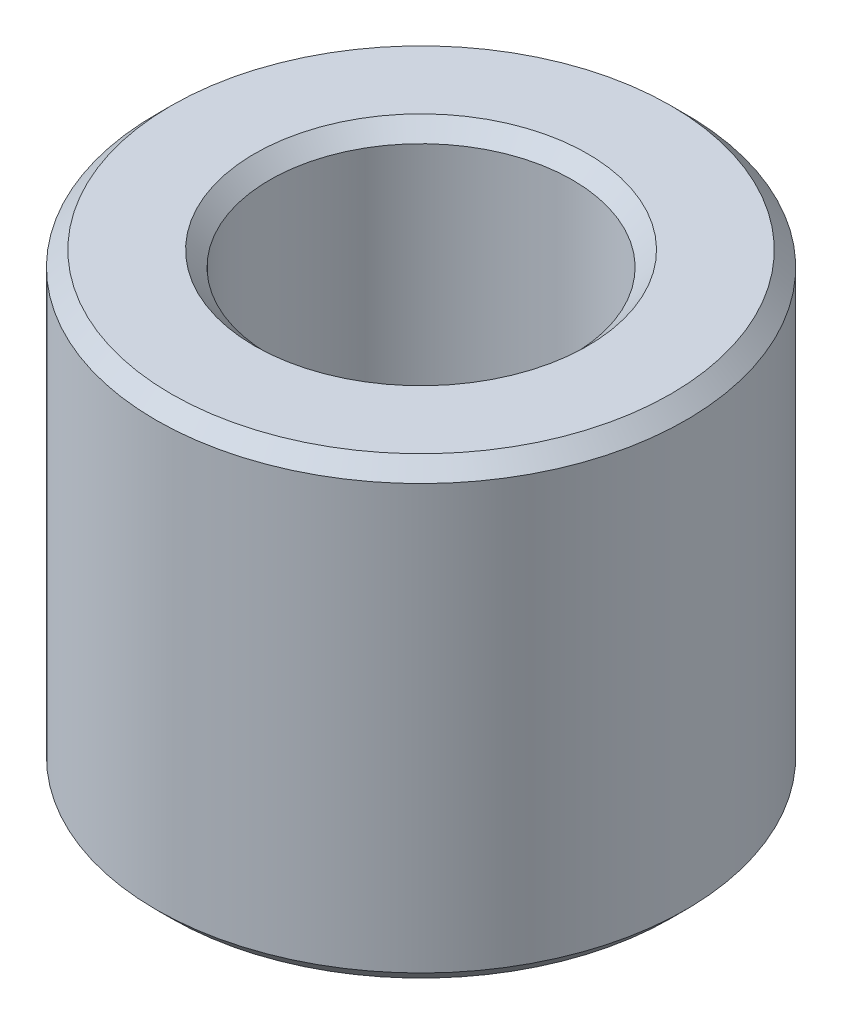
ISO-10303-21;
HEADER;
FILE_DESCRIPTION(('STEP AP214'),'2;1');
FILE_NAME('part.step','',(''),(''),'','','');
FILE_SCHEMA(('AUTOMOTIVE_DESIGN { 1 0 10303 214 1 1 1 1 }'));
ENDSEC;
DATA;
#1=APPLICATION_CONTEXT('core data for automotive mechanical design processes');
#2=APPLICATION_PROTOCOL_DEFINITION('international standard','automotive_design',2000,#1);
#3=PRODUCT_CONTEXT('',#1,'mechanical');
#4=PRODUCT('Part','Part','',(#3));
#5=PRODUCT_RELATED_PRODUCT_CATEGORY('part','',(#4));
#6=PRODUCT_DEFINITION_FORMATION('','',#4);
#7=PRODUCT_DEFINITION_CONTEXT('part definition',#1,'design');
#8=PRODUCT_DEFINITION('design','',#6,#7);
#9=PRODUCT_DEFINITION_SHAPE('','',#8);
#10=(LENGTH_UNIT() NAMED_UNIT(*) SI_UNIT(.MILLI.,.METRE.));
#11=(NAMED_UNIT(*) PLANE_ANGLE_UNIT() SI_UNIT($,.RADIAN.));
#12=(NAMED_UNIT(*) SI_UNIT($,.STERADIAN.) SOLID_ANGLE_UNIT());
#13=UNCERTAINTY_MEASURE_WITH_UNIT(LENGTH_MEASURE(1.E-05),#10,'distance_accuracy_value','');
#14=(GEOMETRIC_REPRESENTATION_CONTEXT(3) GLOBAL_UNCERTAINTY_ASSIGNED_CONTEXT((#13)) GLOBAL_UNIT_ASSIGNED_CONTEXT((#10,
#11,#12)) REPRESENTATION_CONTEXT('',''));
#15=CARTESIAN_POINT('',(0.,0.,0.));
#16=DIRECTION('',(0.,0.,1.));
#17=DIRECTION('',(1.,0.,0.));
#18=AXIS2_PLACEMENT_3D('',#15,#16,#17);
#19=CARTESIAN_POINT('',(0.,6.,0.));
#20=DIRECTION('',(0.,1.,0.));
#21=DIRECTION('',(0.,0.,1.));
#22=AXIS2_PLACEMENT_3D('',#19,#20,#21);
#23=PLANE('',#22);
#24=CARTESIAN_POINT('',(0.,6.,0.));
#25=DIRECTION('',(0.,1.,0.));
#26=DIRECTION('',(0.,0.,1.));
#27=AXIS2_PLACEMENT_3D('',#24,#25,#26);
#28=CIRCLE('',#27,2.2);
#29=CARTESIAN_POINT('',(0.,6.,2.2));
#30=VERTEX_POINT('',#29);
#31=EDGE_CURVE('E10',#30,#30,#28,.F.);
#32=ORIENTED_EDGE('',*,*,#31,.T.);
#33=EDGE_LOOP('',(#32));
#34=FACE_BOUND('',#33,.T.);
#35=CARTESIAN_POINT('',(0.,6.,0.));
#36=DIRECTION('',(0.,1.,0.));
#37=DIRECTION('',(0.,0.,1.));
#38=AXIS2_PLACEMENT_3D('',#35,#36,#37);
#39=CIRCLE('',#38,3.3);
#40=CARTESIAN_POINT('',(0.,6.,3.3));
#41=VERTEX_POINT('',#40);
#42=EDGE_CURVE('E52',#41,#41,#39,.T.);
#43=ORIENTED_EDGE('',*,*,#42,.T.);
#44=EDGE_LOOP('',(#43));
#45=FACE_BOUND('',#44,.T.);
#46=ADVANCED_FACE('F43',(#34,#45),#23,.T.);
#47=CARTESIAN_POINT('',(0.,0.,0.));
#48=DIRECTION('',(0.,1.,0.));
#49=DIRECTION('',(0.,0.,1.));
#50=AXIS2_PLACEMENT_3D('',#47,#48,#49);
#51=PLANE('',#50);
#52=CARTESIAN_POINT('',(0.,0.,0.));
#53=DIRECTION('',(0.,1.,0.));
#54=DIRECTION('',(0.,0.,1.));
#55=AXIS2_PLACEMENT_3D('',#52,#53,#54);
#56=CIRCLE('',#55,2.2);
#57=CARTESIAN_POINT('',(0.,0.,2.2));
#58=VERTEX_POINT('',#57);
#59=EDGE_CURVE('E76',#58,#58,#56,.T.);
#60=ORIENTED_EDGE('',*,*,#59,.T.);
#61=EDGE_LOOP('',(#60));
#62=FACE_BOUND('',#61,.T.);
#63=CARTESIAN_POINT('',(0.,0.,0.));
#64=DIRECTION('',(0.,1.,0.));
#65=DIRECTION('',(0.,0.,1.));
#66=AXIS2_PLACEMENT_3D('',#63,#64,#65);
#67=CIRCLE('',#66,3.3);
#68=CARTESIAN_POINT('',(0.,0.,3.3));
#69=VERTEX_POINT('',#68);
#70=EDGE_CURVE('E80',#69,#69,#67,.F.);
#71=ORIENTED_EDGE('',*,*,#70,.T.);
#72=EDGE_LOOP('',(#71));
#73=FACE_BOUND('',#72,.T.);
#74=ADVANCED_FACE('F85',(#62,#73),#51,.F.);
#75=CARTESIAN_POINT('',(0.,6.,0.));
#76=DIRECTION('',(0.,-1.,0.));
#77=DIRECTION('',(0.,0.,-1.));
#78=AXIS2_PLACEMENT_3D('',#75,#76,#77);
#79=CYLINDRICAL_SURFACE('',#78,3.5);
#80=CARTESIAN_POINT('',(0.,0.200000000000001,0.));
#81=DIRECTION('',(0.,1.,0.));
#82=DIRECTION('',(0.,0.,1.));
#83=AXIS2_PLACEMENT_3D('',#80,#81,#82);
#84=CIRCLE('',#83,3.5);
#85=CARTESIAN_POINT('',(0.,0.200000000000001,3.5));
#86=VERTEX_POINT('',#85);
#87=EDGE_CURVE('E57',#86,#86,#84,.T.);
#88=ORIENTED_EDGE('',*,*,#87,.T.);
#89=EDGE_LOOP('',(#88));
#90=FACE_BOUND('',#89,.T.);
#91=CARTESIAN_POINT('',(0.,5.8,0.));
#92=DIRECTION('',(0.,1.,0.));
#93=DIRECTION('',(0.,0.,1.));
#94=AXIS2_PLACEMENT_3D('',#91,#92,#93);
#95=CIRCLE('',#94,3.5);
#96=CARTESIAN_POINT('',(0.,5.8,3.5));
#97=VERTEX_POINT('',#96);
#98=EDGE_CURVE('E62',#97,#97,#95,.F.);
#99=ORIENTED_EDGE('',*,*,#98,.T.);
#100=EDGE_LOOP('',(#99));
#101=FACE_BOUND('',#100,.T.);
#102=ADVANCED_FACE('F95',(#90,#101),#79,.T.);
#103=CARTESIAN_POINT('',(0.,6.,0.));
#104=DIRECTION('',(0.,-1.,0.));
#105=DIRECTION('',(0.,0.,-1.));
#106=AXIS2_PLACEMENT_3D('',#103,#104,#105);
#107=CYLINDRICAL_SURFACE('',#106,2.);
#108=CARTESIAN_POINT('',(0.,0.200000000000001,0.));
#109=DIRECTION('',(0.,1.,0.));
#110=DIRECTION('',(0.,0.,1.));
#111=AXIS2_PLACEMENT_3D('',#108,#109,#110);
#112=CIRCLE('',#111,2.);
#113=CARTESIAN_POINT('',(0.,0.200000000000001,2.));
#114=VERTEX_POINT('',#113);
#115=EDGE_CURVE('E68',#114,#114,#112,.F.);
#116=ORIENTED_EDGE('',*,*,#115,.T.);
#117=EDGE_LOOP('',(#116));
#118=FACE_BOUND('',#117,.T.);
#119=CARTESIAN_POINT('',(0.,5.8,0.));
#120=DIRECTION('',(0.,1.,0.));
#121=DIRECTION('',(0.,0.,1.));
#122=AXIS2_PLACEMENT_3D('',#119,#120,#121);
#123=CIRCLE('',#122,2.);
#124=CARTESIAN_POINT('',(0.,5.8,2.));
#125=VERTEX_POINT('',#124);
#126=EDGE_CURVE('E72',#125,#125,#123,.T.);
#127=ORIENTED_EDGE('',*,*,#126,.T.);
#128=EDGE_LOOP('',(#127));
#129=FACE_BOUND('',#128,.T.);
#130=ADVANCED_FACE('F98',(#118,#129),#107,.F.);
#131=CARTESIAN_POINT('',(0.,0.,0.));
#132=DIRECTION('',(0.,-1.,0.));
#133=DIRECTION('',(0.,0.,-1.));
#134=AXIS2_PLACEMENT_3D('',#131,#132,#133);
#135=CONICAL_SURFACE('',#134,2.2,0.785398163397446);
#136=ORIENTED_EDGE('',*,*,#115,.F.);
#137=EDGE_LOOP('',(#136));
#138=FACE_BOUND('',#137,.T.);
#139=ORIENTED_EDGE('',*,*,#59,.F.);
#140=EDGE_LOOP('',(#139));
#141=FACE_BOUND('',#140,.T.);
#142=ADVANCED_FACE('F91',(#138,#141),#135,.F.);
#143=CARTESIAN_POINT('',(0.,0.200000000000001,0.));
#144=DIRECTION('',(0.,1.,0.));
#145=DIRECTION('',(0.,0.,1.));
#146=AXIS2_PLACEMENT_3D('',#143,#144,#145);
#147=CONICAL_SURFACE('',#146,3.5,0.785398163397452);
#148=ORIENTED_EDGE('',*,*,#70,.F.);
#149=EDGE_LOOP('',(#148));
#150=FACE_BOUND('',#149,.T.);
#151=ORIENTED_EDGE('',*,*,#87,.F.);
#152=EDGE_LOOP('',(#151));
#153=FACE_BOUND('',#152,.T.);
#154=ADVANCED_FACE('F87',(#150,#153),#147,.T.);
#155=CARTESIAN_POINT('',(0.,5.8,0.));
#156=DIRECTION('',(0.,1.,0.));
#157=DIRECTION('',(0.,0.,1.));
#158=AXIS2_PLACEMENT_3D('',#155,#156,#157);
#159=CONICAL_SURFACE('',#158,2.,0.785398163397453);
#160=ORIENTED_EDGE('',*,*,#31,.F.);
#161=EDGE_LOOP('',(#160));
#162=FACE_BOUND('',#161,.T.);
#163=ORIENTED_EDGE('',*,*,#126,.F.);
#164=EDGE_LOOP('',(#163));
#165=FACE_BOUND('',#164,.T.);
#166=ADVANCED_FACE('F90',(#162,#165),#159,.F.);
#167=CARTESIAN_POINT('',(0.,6.,0.));
#168=DIRECTION('',(0.,-1.,0.));
#169=DIRECTION('',(0.,0.,-1.));
#170=AXIS2_PLACEMENT_3D('',#167,#168,#169);
#171=CONICAL_SURFACE('',#170,3.3,0.785398163397447);
#172=ORIENTED_EDGE('',*,*,#98,.F.);
#173=EDGE_LOOP('',(#172));
#174=FACE_BOUND('',#173,.T.);
#175=ORIENTED_EDGE('',*,*,#42,.F.);
#176=EDGE_LOOP('',(#175));
#177=FACE_BOUND('',#176,.T.);
#178=ADVANCED_FACE('F46',(#174,#177),#171,.T.);
#179=CLOSED_SHELL('',(#46,#74,#102,#130,#142,#154,#166,#178));
#180=MANIFOLD_SOLID_BREP('B2',#179);
#181=ADVANCED_BREP_SHAPE_REPRESENTATION('',(#18,#180),#14);
#182=SHAPE_DEFINITION_REPRESENTATION(#9,#181);
ENDSEC;
END-ISO-10303-21;
